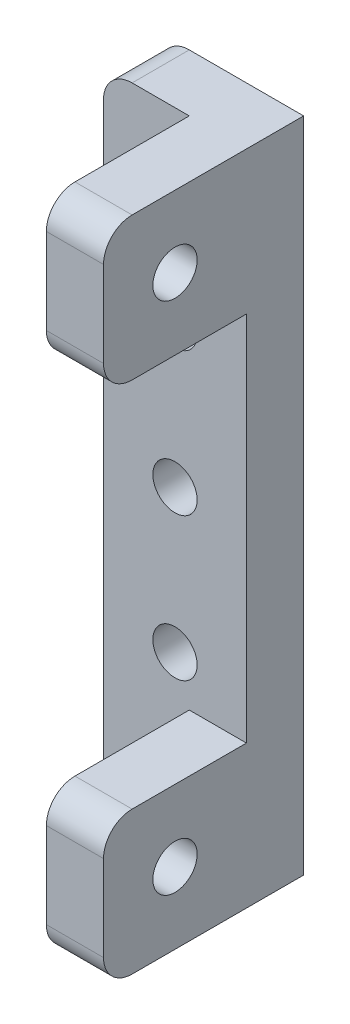
ISO-10303-21;
HEADER;
FILE_DESCRIPTION(('STEP AP214'),'2;1');
FILE_NAME('part.step','',(''),(''),'','','');
FILE_SCHEMA(('AUTOMOTIVE_DESIGN { 1 0 10303 214 1 1 1 1 }'));
ENDSEC;
DATA;
#1=APPLICATION_CONTEXT('core data for automotive mechanical design processes');
#2=APPLICATION_PROTOCOL_DEFINITION('international standard','automotive_design',2000,#1);
#3=PRODUCT_CONTEXT('',#1,'mechanical');
#4=PRODUCT('Part','Part','',(#3));
#5=PRODUCT_RELATED_PRODUCT_CATEGORY('part','',(#4));
#6=PRODUCT_DEFINITION_FORMATION('','',#4);
#7=PRODUCT_DEFINITION_CONTEXT('part definition',#1,'design');
#8=PRODUCT_DEFINITION('design','',#6,#7);
#9=PRODUCT_DEFINITION_SHAPE('','',#8);
#10=(LENGTH_UNIT() NAMED_UNIT(*) SI_UNIT(.MILLI.,.METRE.));
#11=(NAMED_UNIT(*) PLANE_ANGLE_UNIT() SI_UNIT($,.RADIAN.));
#12=(NAMED_UNIT(*) SI_UNIT($,.STERADIAN.) SOLID_ANGLE_UNIT());
#13=UNCERTAINTY_MEASURE_WITH_UNIT(LENGTH_MEASURE(1.E-05),#10,'distance_accuracy_value','');
#14=(GEOMETRIC_REPRESENTATION_CONTEXT(3) GLOBAL_UNCERTAINTY_ASSIGNED_CONTEXT((#13)) GLOBAL_UNIT_ASSIGNED_CONTEXT((#10,
#11,#12)) REPRESENTATION_CONTEXT('',''));
#15=CARTESIAN_POINT('',(0.,0.,0.));
#16=DIRECTION('',(0.,0.,1.));
#17=DIRECTION('',(1.,0.,0.));
#18=AXIS2_PLACEMENT_3D('',#15,#16,#17);
#19=CARTESIAN_POINT('',(0.,0.,4.));
#20=DIRECTION('',(0.,0.,-1.));
#21=DIRECTION('',(-1.,0.,0.));
#22=AXIS2_PLACEMENT_3D('',#19,#20,#21);
#23=PLANE('',#22);
#24=CARTESIAN_POINT('',(0.,10.,4.));
#25=DIRECTION('',(0.,0.,1.));
#26=DIRECTION('',(1.,0.,0.));
#27=AXIS2_PLACEMENT_3D('',#24,#25,#26);
#28=CIRCLE('',#27,1.55);
#29=CARTESIAN_POINT('',(1.55,10.,4.));
#30=VERTEX_POINT('',#29);
#31=EDGE_CURVE('E194',#30,#30,#28,.T.);
#32=ORIENTED_EDGE('',*,*,#31,.F.);
#33=EDGE_LOOP('',(#32));
#34=FACE_BOUND('',#33,.T.);
#35=CARTESIAN_POINT('',(0.,0.,4.));
#36=DIRECTION('',(0.,0.,1.));
#37=DIRECTION('',(1.,0.,0.));
#38=AXIS2_PLACEMENT_3D('',#35,#36,#37);
#39=CIRCLE('',#38,1.55);
#40=CARTESIAN_POINT('',(1.55,0.,4.));
#41=VERTEX_POINT('',#40);
#42=EDGE_CURVE('E188',#41,#41,#39,.T.);
#43=ORIENTED_EDGE('',*,*,#42,.F.);
#44=EDGE_LOOP('',(#43));
#45=FACE_BOUND('',#44,.T.);
#46=CARTESIAN_POINT('',(0.,-10.,4.));
#47=DIRECTION('',(0.,0.,1.));
#48=DIRECTION('',(1.,0.,0.));
#49=AXIS2_PLACEMENT_3D('',#46,#47,#48);
#50=CIRCLE('',#49,1.55);
#51=CARTESIAN_POINT('',(1.55,-10.,4.));
#52=VERTEX_POINT('',#51);
#53=EDGE_CURVE('E182',#52,#52,#50,.T.);
#54=ORIENTED_EDGE('',*,*,#53,.F.);
#55=EDGE_LOOP('',(#54));
#56=FACE_BOUND('',#55,.T.);
#57=DIRECTION('',(-1.,0.,0.));
#58=VECTOR('',#57,1.);
#59=CARTESIAN_POINT('',(-5.,23.,4.));
#60=LINE('',#59,#58);
#61=CARTESIAN_POINT('',(0.999999999999999,23.,4.));
#62=VERTEX_POINT('',#61);
#63=CARTESIAN_POINT('',(-3.,23.,4.));
#64=VERTEX_POINT('',#63);
#65=EDGE_CURVE('E201',#62,#64,#60,.T.);
#66=ORIENTED_EDGE('',*,*,#65,.T.);
#67=CARTESIAN_POINT('',(-3.,21.,4.));
#68=DIRECTION('',(0.,0.,-1.));
#69=DIRECTION('',(-1.,0.,0.));
#70=AXIS2_PLACEMENT_3D('',#67,#68,#69);
#71=CIRCLE('',#70,2.);
#72=CARTESIAN_POINT('',(-5.,21.,4.));
#73=VERTEX_POINT('',#72);
#74=EDGE_CURVE('E257',#64,#73,#71,.F.);
#75=ORIENTED_EDGE('',*,*,#74,.T.);
#76=DIRECTION('',(0.,-1.,0.));
#77=VECTOR('',#76,1.);
#78=CARTESIAN_POINT('',(-5.,-23.,4.));
#79=LINE('',#78,#77);
#80=CARTESIAN_POINT('',(-5.,-21.,4.));
#81=VERTEX_POINT('',#80);
#82=EDGE_CURVE('E204',#73,#81,#79,.T.);
#83=ORIENTED_EDGE('',*,*,#82,.T.);
#84=CARTESIAN_POINT('',(-3.,-21.,4.));
#85=DIRECTION('',(0.,0.,-1.));
#86=DIRECTION('',(-1.,0.,0.));
#87=AXIS2_PLACEMENT_3D('',#84,#85,#86);
#88=CIRCLE('',#87,2.);
#89=CARTESIAN_POINT('',(-3.,-23.,4.));
#90=VERTEX_POINT('',#89);
#91=EDGE_CURVE('E255',#81,#90,#88,.F.);
#92=ORIENTED_EDGE('',*,*,#91,.T.);
#93=DIRECTION('',(1.,0.,0.));
#94=VECTOR('',#93,1.);
#95=CARTESIAN_POINT('',(-5.,-23.,4.));
#96=LINE('',#95,#94);
#97=CARTESIAN_POINT('',(1.00000000000001,-23.,4.));
#98=VERTEX_POINT('',#97);
#99=EDGE_CURVE('E207',#90,#98,#96,.T.);
#100=ORIENTED_EDGE('',*,*,#99,.T.);
#101=DIRECTION('',(0.,-1.,0.));
#102=VECTOR('',#101,1.);
#103=CARTESIAN_POINT('',(1.00000000000001,-23.,4.));
#104=LINE('',#103,#102);
#105=CARTESIAN_POINT('',(1.00000000000001,-13.,4.));
#106=VERTEX_POINT('',#105);
#107=EDGE_CURVE('E285',#106,#98,#104,.T.);
#108=ORIENTED_EDGE('',*,*,#107,.F.);
#109=DIRECTION('',(-1.,0.,0.));
#110=VECTOR('',#109,1.);
#111=CARTESIAN_POINT('',(5.00000000000001,-13.,4.));
#112=LINE('',#111,#110);
#113=CARTESIAN_POINT('',(5.,-13.,4.));
#114=VERTEX_POINT('',#113);
#115=EDGE_CURVE('E289',#114,#106,#112,.T.);
#116=ORIENTED_EDGE('',*,*,#115,.F.);
#117=DIRECTION('',(0.,1.,0.));
#118=VECTOR('',#117,1.);
#119=CARTESIAN_POINT('',(5.,-23.,4.));
#120=LINE('',#119,#118);
#121=CARTESIAN_POINT('',(5.,13.,4.));
#122=VERTEX_POINT('',#121);
#123=EDGE_CURVE('E165',#114,#122,#120,.T.);
#124=ORIENTED_EDGE('',*,*,#123,.T.);
#125=DIRECTION('',(1.,0.,0.));
#126=VECTOR('',#125,1.);
#127=CARTESIAN_POINT('',(5.,13.,4.));
#128=LINE('',#127,#126);
#129=CARTESIAN_POINT('',(1.,13.,4.));
#130=VERTEX_POINT('',#129);
#131=EDGE_CURVE('E148',#130,#122,#128,.T.);
#132=ORIENTED_EDGE('',*,*,#131,.F.);
#133=DIRECTION('',(0.,-1.,0.));
#134=VECTOR('',#133,1.);
#135=CARTESIAN_POINT('',(0.999999999999999,23.,4.));
#136=LINE('',#135,#134);
#137=EDGE_CURVE('E161',#62,#130,#136,.T.);
#138=ORIENTED_EDGE('',*,*,#137,.F.);
#139=EDGE_LOOP('',(#66,#75,#83,#92,#100,#108,#116,#124,#132,#138));
#140=FACE_BOUND('',#139,.T.);
#141=ADVANCED_FACE('F33',(#34,#45,#56,#140),#23,.F.);
#142=CARTESIAN_POINT('',(0.,0.,0.));
#143=DIRECTION('',(0.,0.,-1.));
#144=DIRECTION('',(-1.,0.,0.));
#145=AXIS2_PLACEMENT_3D('',#142,#143,#144);
#146=PLANE('',#145);
#147=CARTESIAN_POINT('',(0.,0.,0.));
#148=DIRECTION('',(0.,0.,1.));
#149=DIRECTION('',(1.,0.,0.));
#150=AXIS2_PLACEMENT_3D('',#147,#148,#149);
#151=CIRCLE('',#150,1.55);
#152=CARTESIAN_POINT('',(1.55,0.,0.));
#153=VERTEX_POINT('',#152);
#154=EDGE_CURVE('E185',#153,#153,#151,.T.);
#155=ORIENTED_EDGE('',*,*,#154,.T.);
#156=EDGE_LOOP('',(#155));
#157=FACE_BOUND('',#156,.T.);
#158=DIRECTION('',(0.,-1.,0.));
#159=VECTOR('',#158,1.);
#160=CARTESIAN_POINT('',(-5.,-23.,0.));
#161=LINE('',#160,#159);
#162=CARTESIAN_POINT('',(-5.,21.,0.));
#163=VERTEX_POINT('',#162);
#164=CARTESIAN_POINT('',(-5.,-21.,0.));
#165=VERTEX_POINT('',#164);
#166=EDGE_CURVE('E216',#163,#165,#161,.T.);
#167=ORIENTED_EDGE('',*,*,#166,.F.);
#168=CARTESIAN_POINT('',(-3.,21.,0.));
#169=DIRECTION('',(0.,0.,-1.));
#170=DIRECTION('',(-1.,0.,0.));
#171=AXIS2_PLACEMENT_3D('',#168,#169,#170);
#172=CIRCLE('',#171,2.);
#173=CARTESIAN_POINT('',(-3.,23.,0.));
#174=VERTEX_POINT('',#173);
#175=EDGE_CURVE('E253',#163,#174,#172,.T.);
#176=ORIENTED_EDGE('',*,*,#175,.T.);
#177=DIRECTION('',(-1.,0.,0.));
#178=VECTOR('',#177,1.);
#179=CARTESIAN_POINT('',(-5.,23.,0.));
#180=LINE('',#179,#178);
#181=CARTESIAN_POINT('',(5.,23.,0.));
#182=VERTEX_POINT('',#181);
#183=EDGE_CURVE('E213',#182,#174,#180,.T.);
#184=ORIENTED_EDGE('',*,*,#183,.F.);
#185=DIRECTION('',(0.,1.,0.));
#186=VECTOR('',#185,1.);
#187=CARTESIAN_POINT('',(5.,-23.,0.));
#188=LINE('',#187,#186);
#189=CARTESIAN_POINT('',(5.,-23.,0.));
#190=VERTEX_POINT('',#189);
#191=EDGE_CURVE('E197',#190,#182,#188,.T.);
#192=ORIENTED_EDGE('',*,*,#191,.F.);
#193=DIRECTION('',(1.,0.,0.));
#194=VECTOR('',#193,1.);
#195=CARTESIAN_POINT('',(-5.,-23.,0.));
#196=LINE('',#195,#194);
#197=CARTESIAN_POINT('',(-3.,-23.,0.));
#198=VERTEX_POINT('',#197);
#199=EDGE_CURVE('E202',#198,#190,#196,.T.);
#200=ORIENTED_EDGE('',*,*,#199,.F.);
#201=CARTESIAN_POINT('',(-3.,-21.,0.));
#202=DIRECTION('',(0.,0.,-1.));
#203=DIRECTION('',(-1.,0.,0.));
#204=AXIS2_PLACEMENT_3D('',#201,#202,#203);
#205=CIRCLE('',#204,2.);
#206=EDGE_CURVE('E251',#198,#165,#205,.T.);
#207=ORIENTED_EDGE('',*,*,#206,.T.);
#208=EDGE_LOOP('',(#167,#176,#184,#192,#200,#207));
#209=FACE_BOUND('',#208,.T.);
#210=CARTESIAN_POINT('',(0.,10.,0.));
#211=DIRECTION('',(0.,0.,1.));
#212=DIRECTION('',(1.,0.,0.));
#213=AXIS2_PLACEMENT_3D('',#210,#211,#212);
#214=CIRCLE('',#213,1.55);
#215=CARTESIAN_POINT('',(1.55,10.,0.));
#216=VERTEX_POINT('',#215);
#217=EDGE_CURVE('E191',#216,#216,#214,.T.);
#218=ORIENTED_EDGE('',*,*,#217,.T.);
#219=EDGE_LOOP('',(#218));
#220=FACE_BOUND('',#219,.T.);
#221=CARTESIAN_POINT('',(0.,-10.,0.));
#222=DIRECTION('',(0.,0.,1.));
#223=DIRECTION('',(1.,0.,0.));
#224=AXIS2_PLACEMENT_3D('',#221,#222,#223);
#225=CIRCLE('',#224,1.55);
#226=CARTESIAN_POINT('',(1.55,-10.,0.));
#227=VERTEX_POINT('',#226);
#228=EDGE_CURVE('E181',#227,#227,#225,.T.);
#229=ORIENTED_EDGE('',*,*,#228,.T.);
#230=EDGE_LOOP('',(#229));
#231=FACE_BOUND('',#230,.T.);
#232=ADVANCED_FACE('F324',(#157,#209,#220,#231),#146,.T.);
#233=CARTESIAN_POINT('',(5.,-23.,4.));
#234=DIRECTION('',(-1.,0.,0.));
#235=DIRECTION('',(0.,-1.,0.));
#236=AXIS2_PLACEMENT_3D('',#233,#234,#235);
#237=PLANE('',#236);
#238=CARTESIAN_POINT('',(5.,-18.,9.));
#239=DIRECTION('',(-1.,0.,0.));
#240=DIRECTION('',(0.,-1.,0.));
#241=AXIS2_PLACEMENT_3D('',#238,#239,#240);
#242=CIRCLE('',#241,1.55);
#243=CARTESIAN_POINT('',(5.,-19.55,9.));
#244=VERTEX_POINT('',#243);
#245=EDGE_CURVE('E292',#244,#244,#242,.F.);
#246=ORIENTED_EDGE('',*,*,#245,.F.);
#247=EDGE_LOOP('',(#246));
#248=FACE_BOUND('',#247,.T.);
#249=CARTESIAN_POINT('',(5.,18.,9.));
#250=DIRECTION('',(-1.,0.,0.));
#251=DIRECTION('',(0.,-1.,0.));
#252=AXIS2_PLACEMENT_3D('',#249,#250,#251);
#253=CIRCLE('',#252,1.55);
#254=CARTESIAN_POINT('',(5.,16.45,9.));
#255=VERTEX_POINT('',#254);
#256=EDGE_CURVE('E565',#255,#255,#253,.F.);
#257=ORIENTED_EDGE('',*,*,#256,.F.);
#258=EDGE_LOOP('',(#257));
#259=FACE_BOUND('',#258,.T.);
#260=DIRECTION('',(0.,0.,-1.));
#261=VECTOR('',#260,1.);
#262=CARTESIAN_POINT('',(5.,23.,4.));
#263=LINE('',#262,#261);
#264=CARTESIAN_POINT('',(5.,23.,12.));
#265=VERTEX_POINT('',#264);
#266=EDGE_CURVE('E222',#265,#182,#263,.T.);
#267=ORIENTED_EDGE('',*,*,#266,.F.);
#268=CARTESIAN_POINT('',(5.,21.,12.));
#269=DIRECTION('',(-1.,0.,0.));
#270=DIRECTION('',(0.,-1.,0.));
#271=AXIS2_PLACEMENT_3D('',#268,#269,#270);
#272=CIRCLE('',#271,2.);
#273=CARTESIAN_POINT('',(5.,21.,14.));
#274=VERTEX_POINT('',#273);
#275=EDGE_CURVE('E244',#265,#274,#272,.F.);
#276=ORIENTED_EDGE('',*,*,#275,.T.);
#277=DIRECTION('',(0.,1.,0.));
#278=VECTOR('',#277,1.);
#279=CARTESIAN_POINT('',(5.,23.,14.));
#280=LINE('',#279,#278);
#281=CARTESIAN_POINT('',(5.,15.,14.));
#282=VERTEX_POINT('',#281);
#283=EDGE_CURVE('E166',#282,#274,#280,.T.);
#284=ORIENTED_EDGE('',*,*,#283,.F.);
#285=CARTESIAN_POINT('',(5.,15.,12.));
#286=DIRECTION('',(-1.,0.,0.));
#287=DIRECTION('',(0.,-1.,0.));
#288=AXIS2_PLACEMENT_3D('',#285,#286,#287);
#289=CIRCLE('',#288,2.);
#290=CARTESIAN_POINT('',(5.,13.,12.));
#291=VERTEX_POINT('',#290);
#292=EDGE_CURVE('E242',#282,#291,#289,.F.);
#293=ORIENTED_EDGE('',*,*,#292,.T.);
#294=DIRECTION('',(0.,0.,-1.));
#295=VECTOR('',#294,1.);
#296=CARTESIAN_POINT('',(5.,13.,14.));
#297=LINE('',#296,#295);
#298=EDGE_CURVE('E155',#291,#122,#297,.T.);
#299=ORIENTED_EDGE('',*,*,#298,.T.);
#300=ORIENTED_EDGE('',*,*,#123,.F.);
#301=DIRECTION('',(0.,0.,-1.));
#302=VECTOR('',#301,1.);
#303=CARTESIAN_POINT('',(5.00000000000001,-13.,14.));
#304=LINE('',#303,#302);
#305=CARTESIAN_POINT('',(5.00000000000001,-13.,12.));
#306=VERTEX_POINT('',#305);
#307=EDGE_CURVE('E171',#306,#114,#304,.T.);
#308=ORIENTED_EDGE('',*,*,#307,.F.);
#309=CARTESIAN_POINT('',(5.,-15.,12.));
#310=DIRECTION('',(-1.,0.,0.));
#311=DIRECTION('',(0.,-1.,0.));
#312=AXIS2_PLACEMENT_3D('',#309,#310,#311);
#313=CIRCLE('',#312,2.);
#314=CARTESIAN_POINT('',(5.,-15.,14.));
#315=VERTEX_POINT('',#314);
#316=EDGE_CURVE('E240',#306,#315,#313,.F.);
#317=ORIENTED_EDGE('',*,*,#316,.T.);
#318=DIRECTION('',(0.,1.,0.));
#319=VECTOR('',#318,1.);
#320=CARTESIAN_POINT('',(5.,-23.,14.));
#321=LINE('',#320,#319);
#322=CARTESIAN_POINT('',(5.,-21.,14.));
#323=VERTEX_POINT('',#322);
#324=EDGE_CURVE('E278',#323,#315,#321,.T.);
#325=ORIENTED_EDGE('',*,*,#324,.F.);
#326=CARTESIAN_POINT('',(5.,-21.,12.));
#327=DIRECTION('',(-1.,0.,0.));
#328=DIRECTION('',(0.,-1.,0.));
#329=AXIS2_PLACEMENT_3D('',#326,#327,#328);
#330=CIRCLE('',#329,2.);
#331=CARTESIAN_POINT('',(5.,-23.,12.));
#332=VERTEX_POINT('',#331);
#333=EDGE_CURVE('E238',#323,#332,#330,.F.);
#334=ORIENTED_EDGE('',*,*,#333,.T.);
#335=DIRECTION('',(0.,0.,-1.));
#336=VECTOR('',#335,1.);
#337=CARTESIAN_POINT('',(5.,-23.,4.));
#338=LINE('',#337,#336);
#339=EDGE_CURVE('E210',#332,#190,#338,.T.);
#340=ORIENTED_EDGE('',*,*,#339,.T.);
#341=ORIENTED_EDGE('',*,*,#191,.T.);
#342=EDGE_LOOP('',(#267,#276,#284,#293,#299,#300,#308,#317,#325,#334,#340,#341));
#343=FACE_BOUND('',#342,.T.);
#344=ADVANCED_FACE('F306',(#248,#259,#343),#237,.F.);
#345=CARTESIAN_POINT('',(-5.,23.,4.));
#346=DIRECTION('',(0.,-1.,0.));
#347=DIRECTION('',(0.,0.,-1.));
#348=AXIS2_PLACEMENT_3D('',#345,#346,#347);
#349=PLANE('',#348);
#350=DIRECTION('',(0.,0.,-1.));
#351=VECTOR('',#350,1.);
#352=CARTESIAN_POINT('',(0.999999999999999,23.,14.));
#353=LINE('',#352,#351);
#354=CARTESIAN_POINT('',(0.999999999999999,23.,12.));
#355=VERTEX_POINT('',#354);
#356=EDGE_CURVE('E154',#355,#62,#353,.T.);
#357=ORIENTED_EDGE('',*,*,#356,.F.);
#358=DIRECTION('',(-1.,0.,0.));
#359=VECTOR('',#358,1.);
#360=CARTESIAN_POINT('',(-5.,23.,12.));
#361=LINE('',#360,#359);
#362=EDGE_CURVE('E236',#355,#265,#361,.F.);
#363=ORIENTED_EDGE('',*,*,#362,.T.);
#364=ORIENTED_EDGE('',*,*,#266,.T.);
#365=ORIENTED_EDGE('',*,*,#183,.T.);
#366=DIRECTION('',(0.,0.,-1.));
#367=VECTOR('',#366,1.);
#368=CARTESIAN_POINT('',(-3.,23.,4.));
#369=LINE('',#368,#367);
#370=EDGE_CURVE('E234',#174,#64,#369,.F.);
#371=ORIENTED_EDGE('',*,*,#370,.T.);
#372=ORIENTED_EDGE('',*,*,#65,.F.);
#373=EDGE_LOOP('',(#357,#363,#364,#365,#371,#372));
#374=FACE_BOUND('',#373,.T.);
#375=ADVANCED_FACE('F312',(#374),#349,.F.);
#376=CARTESIAN_POINT('',(-5.,-23.,4.));
#377=DIRECTION('',(1.,0.,0.));
#378=DIRECTION('',(0.,1.,0.));
#379=AXIS2_PLACEMENT_3D('',#376,#377,#378);
#380=PLANE('',#379);
#381=ORIENTED_EDGE('',*,*,#82,.F.);
#382=DIRECTION('',(0.,0.,-1.));
#383=VECTOR('',#382,1.);
#384=CARTESIAN_POINT('',(-5.,21.,4.));
#385=LINE('',#384,#383);
#386=EDGE_CURVE('E248',#73,#163,#385,.T.);
#387=ORIENTED_EDGE('',*,*,#386,.T.);
#388=ORIENTED_EDGE('',*,*,#166,.T.);
#389=DIRECTION('',(0.,0.,-1.));
#390=VECTOR('',#389,1.);
#391=CARTESIAN_POINT('',(-5.,-21.,4.));
#392=LINE('',#391,#390);
#393=EDGE_CURVE('E246',#165,#81,#392,.F.);
#394=ORIENTED_EDGE('',*,*,#393,.T.);
#395=EDGE_LOOP('',(#381,#387,#388,#394));
#396=FACE_BOUND('',#395,.T.);
#397=ADVANCED_FACE('F321',(#396),#380,.F.);
#398=CARTESIAN_POINT('',(-5.,-23.,4.));
#399=DIRECTION('',(0.,1.,0.));
#400=DIRECTION('',(0.,0.,1.));
#401=AXIS2_PLACEMENT_3D('',#398,#399,#400);
#402=PLANE('',#401);
#403=ORIENTED_EDGE('',*,*,#99,.F.);
#404=DIRECTION('',(0.,0.,-1.));
#405=VECTOR('',#404,1.);
#406=CARTESIAN_POINT('',(-3.,-23.,4.));
#407=LINE('',#406,#405);
#408=EDGE_CURVE('E262',#90,#198,#407,.T.);
#409=ORIENTED_EDGE('',*,*,#408,.T.);
#410=ORIENTED_EDGE('',*,*,#199,.T.);
#411=ORIENTED_EDGE('',*,*,#339,.F.);
#412=DIRECTION('',(1.,0.,0.));
#413=VECTOR('',#412,1.);
#414=CARTESIAN_POINT('',(1.00000000000001,-23.,12.));
#415=LINE('',#414,#413);
#416=CARTESIAN_POINT('',(1.00000000000001,-23.,12.));
#417=VERTEX_POINT('',#416);
#418=EDGE_CURVE('E260',#332,#417,#415,.F.);
#419=ORIENTED_EDGE('',*,*,#418,.T.);
#420=DIRECTION('',(0.,0.,-1.));
#421=VECTOR('',#420,1.);
#422=CARTESIAN_POINT('',(1.00000000000001,-23.,14.));
#423=LINE('',#422,#421);
#424=EDGE_CURVE('E282',#417,#98,#423,.T.);
#425=ORIENTED_EDGE('',*,*,#424,.T.);
#426=EDGE_LOOP('',(#403,#409,#410,#411,#419,#425));
#427=FACE_BOUND('',#426,.T.);
#428=ADVANCED_FACE('F335',(#427),#402,.F.);
#429=CARTESIAN_POINT('',(0.,10.,4.));
#430=DIRECTION('',(0.,0.,-1.));
#431=DIRECTION('',(-1.,0.,0.));
#432=AXIS2_PLACEMENT_3D('',#429,#430,#431);
#433=CYLINDRICAL_SURFACE('',#432,1.55);
#434=ORIENTED_EDGE('',*,*,#31,.T.);
#435=EDGE_LOOP('',(#434));
#436=FACE_BOUND('',#435,.T.);
#437=ORIENTED_EDGE('',*,*,#217,.F.);
#438=EDGE_LOOP('',(#437));
#439=FACE_BOUND('',#438,.T.);
#440=ADVANCED_FACE('F361',(#436,#439),#433,.F.);
#441=CARTESIAN_POINT('',(0.,0.,4.));
#442=DIRECTION('',(0.,0.,-1.));
#443=DIRECTION('',(-1.,0.,0.));
#444=AXIS2_PLACEMENT_3D('',#441,#442,#443);
#445=CYLINDRICAL_SURFACE('',#444,1.55);
#446=ORIENTED_EDGE('',*,*,#42,.T.);
#447=EDGE_LOOP('',(#446));
#448=FACE_BOUND('',#447,.T.);
#449=ORIENTED_EDGE('',*,*,#154,.F.);
#450=EDGE_LOOP('',(#449));
#451=FACE_BOUND('',#450,.T.);
#452=ADVANCED_FACE('F520',(#448,#451),#445,.F.);
#453=CARTESIAN_POINT('',(0.,-10.,4.));
#454=DIRECTION('',(0.,0.,-1.));
#455=DIRECTION('',(-1.,0.,0.));
#456=AXIS2_PLACEMENT_3D('',#453,#454,#455);
#457=CYLINDRICAL_SURFACE('',#456,1.55);
#458=ORIENTED_EDGE('',*,*,#53,.T.);
#459=EDGE_LOOP('',(#458));
#460=FACE_BOUND('',#459,.T.);
#461=ORIENTED_EDGE('',*,*,#228,.F.);
#462=EDGE_LOOP('',(#461));
#463=FACE_BOUND('',#462,.T.);
#464=ADVANCED_FACE('F472',(#460,#463),#457,.F.);
#465=CARTESIAN_POINT('',(0.999999999999999,23.,14.));
#466=DIRECTION('',(1.,0.,0.));
#467=DIRECTION('',(0.,1.,0.));
#468=AXIS2_PLACEMENT_3D('',#465,#466,#467);
#469=PLANE('',#468);
#470=CARTESIAN_POINT('',(0.999999999999999,18.,9.));
#471=DIRECTION('',(-1.,0.,0.));
#472=DIRECTION('',(0.,-1.,0.));
#473=AXIS2_PLACEMENT_3D('',#470,#471,#472);
#474=CIRCLE('',#473,1.55);
#475=CARTESIAN_POINT('',(0.999999999999999,16.45,9.));
#476=VERTEX_POINT('',#475);
#477=EDGE_CURVE('E564',#476,#476,#474,.T.);
#478=ORIENTED_EDGE('',*,*,#477,.F.);
#479=EDGE_LOOP('',(#478));
#480=FACE_BOUND('',#479,.T.);
#481=DIRECTION('',(0.,-1.,0.));
#482=VECTOR('',#481,1.);
#483=CARTESIAN_POINT('',(0.999999999999999,23.,14.));
#484=LINE('',#483,#482);
#485=CARTESIAN_POINT('',(0.999999999999999,21.,14.));
#486=VERTEX_POINT('',#485);
#487=CARTESIAN_POINT('',(1.,15.,14.));
#488=VERTEX_POINT('',#487);
#489=EDGE_CURVE('E176',#486,#488,#484,.T.);
#490=ORIENTED_EDGE('',*,*,#489,.F.);
#491=CARTESIAN_POINT('',(0.999999999999999,21.,12.));
#492=DIRECTION('',(1.,0.,0.));
#493=DIRECTION('',(0.,1.,0.));
#494=AXIS2_PLACEMENT_3D('',#491,#492,#493);
#495=CIRCLE('',#494,2.);
#496=EDGE_CURVE('E232',#486,#355,#495,.F.);
#497=ORIENTED_EDGE('',*,*,#496,.T.);
#498=ORIENTED_EDGE('',*,*,#356,.T.);
#499=ORIENTED_EDGE('',*,*,#137,.T.);
#500=DIRECTION('',(0.,0.,-1.));
#501=VECTOR('',#500,1.);
#502=CARTESIAN_POINT('',(1.,13.,14.));
#503=LINE('',#502,#501);
#504=CARTESIAN_POINT('',(1.,13.,12.));
#505=VERTEX_POINT('',#504);
#506=EDGE_CURVE('E144',#505,#130,#503,.T.);
#507=ORIENTED_EDGE('',*,*,#506,.F.);
#508=CARTESIAN_POINT('',(1.,15.,12.));
#509=DIRECTION('',(1.,0.,0.));
#510=DIRECTION('',(0.,1.,0.));
#511=AXIS2_PLACEMENT_3D('',#508,#509,#510);
#512=CIRCLE('',#511,2.);
#513=EDGE_CURVE('E230',#505,#488,#512,.F.);
#514=ORIENTED_EDGE('',*,*,#513,.T.);
#515=EDGE_LOOP('',(#490,#497,#498,#499,#507,#514));
#516=FACE_BOUND('',#515,.T.);
#517=ADVANCED_FACE('F169',(#480,#516),#469,.F.);
#518=CARTESIAN_POINT('',(5.,13.,14.));
#519=DIRECTION('',(0.,1.,0.));
#520=DIRECTION('',(0.,0.,1.));
#521=AXIS2_PLACEMENT_3D('',#518,#519,#520);
#522=PLANE('',#521);
#523=ORIENTED_EDGE('',*,*,#298,.F.);
#524=DIRECTION('',(1.,0.,0.));
#525=VECTOR('',#524,1.);
#526=CARTESIAN_POINT('',(5.,13.,12.));
#527=LINE('',#526,#525);
#528=EDGE_CURVE('E150',#291,#505,#527,.F.);
#529=ORIENTED_EDGE('',*,*,#528,.T.);
#530=ORIENTED_EDGE('',*,*,#506,.T.);
#531=ORIENTED_EDGE('',*,*,#131,.T.);
#532=EDGE_LOOP('',(#523,#529,#530,#531));
#533=FACE_BOUND('',#532,.T.);
#534=ADVANCED_FACE('F147',(#533),#522,.F.);
#535=CARTESIAN_POINT('',(0.,0.,14.));
#536=DIRECTION('',(0.,0.,-1.));
#537=DIRECTION('',(-1.,0.,0.));
#538=AXIS2_PLACEMENT_3D('',#535,#536,#537);
#539=PLANE('',#538);
#540=ORIENTED_EDGE('',*,*,#283,.T.);
#541=DIRECTION('',(-1.,0.,0.));
#542=VECTOR('',#541,1.);
#543=CARTESIAN_POINT('',(0.,21.,14.));
#544=LINE('',#543,#542);
#545=EDGE_CURVE('E227',#274,#486,#544,.T.);
#546=ORIENTED_EDGE('',*,*,#545,.T.);
#547=ORIENTED_EDGE('',*,*,#489,.T.);
#548=DIRECTION('',(1.,0.,0.));
#549=VECTOR('',#548,1.);
#550=CARTESIAN_POINT('',(0.,15.,14.));
#551=LINE('',#550,#549);
#552=EDGE_CURVE('E224',#488,#282,#551,.T.);
#553=ORIENTED_EDGE('',*,*,#552,.T.);
#554=EDGE_LOOP('',(#540,#546,#547,#553));
#555=FACE_BOUND('',#554,.T.);
#556=ADVANCED_FACE('F301',(#555),#539,.F.);
#557=CARTESIAN_POINT('',(5.00000000000001,-13.,14.));
#558=DIRECTION('',(0.,-1.,0.));
#559=DIRECTION('',(1.,0.,0.));
#560=AXIS2_PLACEMENT_3D('',#557,#558,#559);
#561=PLANE('',#560);
#562=DIRECTION('',(0.,0.,-1.));
#563=VECTOR('',#562,1.);
#564=CARTESIAN_POINT('',(1.00000000000001,-13.,14.));
#565=LINE('',#564,#563);
#566=CARTESIAN_POINT('',(1.00000000000001,-13.,12.));
#567=VERTEX_POINT('',#566);
#568=EDGE_CURVE('E173',#567,#106,#565,.T.);
#569=ORIENTED_EDGE('',*,*,#568,.F.);
#570=DIRECTION('',(-1.,0.,0.));
#571=VECTOR('',#570,1.);
#572=CARTESIAN_POINT('',(5.00000000000001,-13.,12.));
#573=LINE('',#572,#571);
#574=EDGE_CURVE('E11',#567,#306,#573,.F.);
#575=ORIENTED_EDGE('',*,*,#574,.T.);
#576=ORIENTED_EDGE('',*,*,#307,.T.);
#577=ORIENTED_EDGE('',*,*,#115,.T.);
#578=EDGE_LOOP('',(#569,#575,#576,#577));
#579=FACE_BOUND('',#578,.T.);
#580=ADVANCED_FACE('F340',(#579),#561,.F.);
#581=CARTESIAN_POINT('',(1.00000000000001,-23.,14.));
#582=DIRECTION('',(1.,0.,0.));
#583=DIRECTION('',(0.,0.,-1.));
#584=AXIS2_PLACEMENT_3D('',#581,#582,#583);
#585=PLANE('',#584);
#586=CARTESIAN_POINT('',(1.,-18.,9.));
#587=DIRECTION('',(-1.,0.,0.));
#588=DIRECTION('',(0.,-1.,0.));
#589=AXIS2_PLACEMENT_3D('',#586,#587,#588);
#590=CIRCLE('',#589,1.55);
#591=CARTESIAN_POINT('',(1.,-19.55,9.));
#592=VERTEX_POINT('',#591);
#593=EDGE_CURVE('E568',#592,#592,#590,.T.);
#594=ORIENTED_EDGE('',*,*,#593,.F.);
#595=EDGE_LOOP('',(#594));
#596=FACE_BOUND('',#595,.T.);
#597=DIRECTION('',(0.,-1.,0.));
#598=VECTOR('',#597,1.);
#599=CARTESIAN_POINT('',(1.00000000000001,-23.,14.));
#600=LINE('',#599,#598);
#601=CARTESIAN_POINT('',(1.00000000000001,-15.,14.));
#602=VERTEX_POINT('',#601);
#603=CARTESIAN_POINT('',(1.00000000000001,-21.,14.));
#604=VERTEX_POINT('',#603);
#605=EDGE_CURVE('E275',#602,#604,#600,.T.);
#606=ORIENTED_EDGE('',*,*,#605,.F.);
#607=CARTESIAN_POINT('',(1.00000000000001,-15.,12.));
#608=DIRECTION('',(1.,0.,0.));
#609=DIRECTION('',(0.,0.,-1.));
#610=AXIS2_PLACEMENT_3D('',#607,#608,#609);
#611=CIRCLE('',#610,2.);
#612=EDGE_CURVE('E41',#602,#567,#611,.F.);
#613=ORIENTED_EDGE('',*,*,#612,.T.);
#614=ORIENTED_EDGE('',*,*,#568,.T.);
#615=ORIENTED_EDGE('',*,*,#107,.T.);
#616=ORIENTED_EDGE('',*,*,#424,.F.);
#617=CARTESIAN_POINT('',(1.00000000000001,-21.,12.));
#618=DIRECTION('',(1.,0.,0.));
#619=DIRECTION('',(0.,0.,-1.));
#620=AXIS2_PLACEMENT_3D('',#617,#618,#619);
#621=CIRCLE('',#620,2.);
#622=EDGE_CURVE('E53',#417,#604,#621,.F.);
#623=ORIENTED_EDGE('',*,*,#622,.T.);
#624=EDGE_LOOP('',(#606,#613,#614,#615,#616,#623));
#625=FACE_BOUND('',#624,.T.);
#626=ADVANCED_FACE('F281',(#596,#625),#585,.F.);
#627=CARTESIAN_POINT('',(0.,0.,14.));
#628=DIRECTION('',(0.,0.,1.));
#629=DIRECTION('',(1.,0.,0.));
#630=AXIS2_PLACEMENT_3D('',#627,#628,#629);
#631=PLANE('',#630);
#632=ORIENTED_EDGE('',*,*,#324,.T.);
#633=DIRECTION('',(-1.,0.,0.));
#634=VECTOR('',#633,1.);
#635=CARTESIAN_POINT('',(1.00000000000001,-15.,14.));
#636=LINE('',#635,#634);
#637=EDGE_CURVE('E268',#315,#602,#636,.T.);
#638=ORIENTED_EDGE('',*,*,#637,.T.);
#639=ORIENTED_EDGE('',*,*,#605,.T.);
#640=DIRECTION('',(1.,0.,0.));
#641=VECTOR('',#640,1.);
#642=CARTESIAN_POINT('',(5.,-21.,14.));
#643=LINE('',#642,#641);
#644=EDGE_CURVE('E265',#604,#323,#643,.T.);
#645=ORIENTED_EDGE('',*,*,#644,.T.);
#646=EDGE_LOOP('',(#632,#638,#639,#645));
#647=FACE_BOUND('',#646,.T.);
#648=ADVANCED_FACE('F274',(#647),#631,.T.);
#649=CARTESIAN_POINT('',(5.00100000000001,-18.,9.));
#650=DIRECTION('',(-1.,0.,0.));
#651=DIRECTION('',(0.,-1.,0.));
#652=AXIS2_PLACEMENT_3D('',#649,#650,#651);
#653=CYLINDRICAL_SURFACE('',#652,1.55);
#654=ORIENTED_EDGE('',*,*,#593,.T.);
#655=EDGE_LOOP('',(#654));
#656=FACE_BOUND('',#655,.T.);
#657=ORIENTED_EDGE('',*,*,#245,.T.);
#658=EDGE_LOOP('',(#657));
#659=FACE_BOUND('',#658,.T.);
#660=ADVANCED_FACE('F419',(#656,#659),#653,.F.);
#661=CARTESIAN_POINT('',(5.00100000000001,18.,9.));
#662=DIRECTION('',(-1.,0.,0.));
#663=DIRECTION('',(0.,-1.,0.));
#664=AXIS2_PLACEMENT_3D('',#661,#662,#663);
#665=CYLINDRICAL_SURFACE('',#664,1.55);
#666=ORIENTED_EDGE('',*,*,#477,.T.);
#667=EDGE_LOOP('',(#666));
#668=FACE_BOUND('',#667,.T.);
#669=ORIENTED_EDGE('',*,*,#256,.T.);
#670=EDGE_LOOP('',(#669));
#671=FACE_BOUND('',#670,.T.);
#672=ADVANCED_FACE('F375',(#668,#671),#665,.F.);
#673=CARTESIAN_POINT('',(0.,21.,12.));
#674=DIRECTION('',(-1.,0.,0.));
#675=DIRECTION('',(0.,0.,1.));
#676=AXIS2_PLACEMENT_3D('',#673,#674,#675);
#677=CYLINDRICAL_SURFACE('',#676,2.);
#678=ORIENTED_EDGE('',*,*,#275,.F.);
#679=ORIENTED_EDGE('',*,*,#362,.F.);
#680=ORIENTED_EDGE('',*,*,#496,.F.);
#681=ORIENTED_EDGE('',*,*,#545,.F.);
#682=EDGE_LOOP('',(#678,#679,#680,#681));
#683=FACE_BOUND('',#682,.T.);
#684=ADVANCED_FACE('F310',(#683),#677,.T.);
#685=CARTESIAN_POINT('',(-3.,21.,4.));
#686=DIRECTION('',(0.,0.,-1.));
#687=DIRECTION('',(-1.,0.,0.));
#688=AXIS2_PLACEMENT_3D('',#685,#686,#687);
#689=CYLINDRICAL_SURFACE('',#688,2.);
#690=ORIENTED_EDGE('',*,*,#74,.F.);
#691=ORIENTED_EDGE('',*,*,#370,.F.);
#692=ORIENTED_EDGE('',*,*,#175,.F.);
#693=ORIENTED_EDGE('',*,*,#386,.F.);
#694=EDGE_LOOP('',(#690,#691,#692,#693));
#695=FACE_BOUND('',#694,.T.);
#696=ADVANCED_FACE('F318',(#695),#689,.T.);
#697=CARTESIAN_POINT('',(0.,15.,12.));
#698=DIRECTION('',(1.,0.,0.));
#699=DIRECTION('',(0.,0.,-1.));
#700=AXIS2_PLACEMENT_3D('',#697,#698,#699);
#701=CYLINDRICAL_SURFACE('',#700,2.);
#702=ORIENTED_EDGE('',*,*,#513,.F.);
#703=ORIENTED_EDGE('',*,*,#528,.F.);
#704=ORIENTED_EDGE('',*,*,#292,.F.);
#705=ORIENTED_EDGE('',*,*,#552,.F.);
#706=EDGE_LOOP('',(#702,#703,#704,#705));
#707=FACE_BOUND('',#706,.T.);
#708=ADVANCED_FACE('F303',(#707),#701,.T.);
#709=CARTESIAN_POINT('',(-3.,-21.,4.));
#710=DIRECTION('',(0.,0.,-1.));
#711=DIRECTION('',(-1.,0.,0.));
#712=AXIS2_PLACEMENT_3D('',#709,#710,#711);
#713=CYLINDRICAL_SURFACE('',#712,2.);
#714=ORIENTED_EDGE('',*,*,#91,.F.);
#715=ORIENTED_EDGE('',*,*,#393,.F.);
#716=ORIENTED_EDGE('',*,*,#206,.F.);
#717=ORIENTED_EDGE('',*,*,#408,.F.);
#718=EDGE_LOOP('',(#714,#715,#716,#717));
#719=FACE_BOUND('',#718,.T.);
#720=ADVANCED_FACE('F332',(#719),#713,.T.);
#721=CARTESIAN_POINT('',(0.,-15.,12.));
#722=DIRECTION('',(1.,0.,0.));
#723=DIRECTION('',(0.,1.,0.));
#724=AXIS2_PLACEMENT_3D('',#721,#722,#723);
#725=CYLINDRICAL_SURFACE('',#724,2.);
#726=ORIENTED_EDGE('',*,*,#316,.F.);
#727=ORIENTED_EDGE('',*,*,#574,.F.);
#728=ORIENTED_EDGE('',*,*,#612,.F.);
#729=ORIENTED_EDGE('',*,*,#637,.F.);
#730=EDGE_LOOP('',(#726,#727,#728,#729));
#731=FACE_BOUND('',#730,.T.);
#732=ADVANCED_FACE('F342',(#731),#725,.T.);
#733=CARTESIAN_POINT('',(0.,-21.,12.));
#734=DIRECTION('',(-1.,0.,0.));
#735=DIRECTION('',(0.,0.,1.));
#736=AXIS2_PLACEMENT_3D('',#733,#734,#735);
#737=CYLINDRICAL_SURFACE('',#736,2.);
#738=ORIENTED_EDGE('',*,*,#622,.F.);
#739=ORIENTED_EDGE('',*,*,#418,.F.);
#740=ORIENTED_EDGE('',*,*,#333,.F.);
#741=ORIENTED_EDGE('',*,*,#644,.F.);
#742=EDGE_LOOP('',(#738,#739,#740,#741));
#743=FACE_BOUND('',#742,.T.);
#744=ADVANCED_FACE('F35',(#743),#737,.T.);
#745=CLOSED_SHELL('',(#141,#232,#344,#375,#397,#428,#440,#452,#464,#517,#534,#556,#580,#626,
#648,#660,#672,#684,#696,#708,#720,#732,#744));
#746=MANIFOLD_SOLID_BREP('B2',#745);
#747=ADVANCED_BREP_SHAPE_REPRESENTATION('',(#18,#746),#14);
#748=SHAPE_DEFINITION_REPRESENTATION(#9,#747);
ENDSEC;
END-ISO-10303-21;
